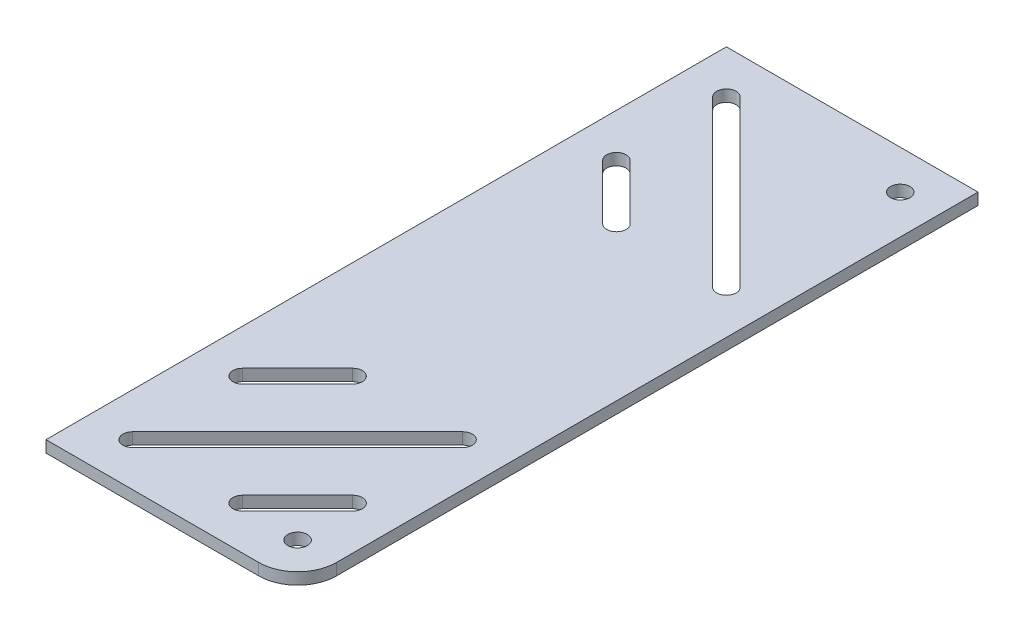
ISO-10303-21;
HEADER;
FILE_DESCRIPTION(('STEP AP214'),'2;1');
FILE_NAME('part.step','',(''),(''),'','','');
FILE_SCHEMA(('AUTOMOTIVE_DESIGN { 1 0 10303 214 1 1 1 1 }'));
ENDSEC;
DATA;
#1=APPLICATION_CONTEXT('core data for automotive mechanical design processes');
#2=APPLICATION_PROTOCOL_DEFINITION('international standard','automotive_design',2000,#1);
#3=PRODUCT_CONTEXT('',#1,'mechanical');
#4=PRODUCT('Part','Part','',(#3));
#5=PRODUCT_RELATED_PRODUCT_CATEGORY('part','',(#4));
#6=PRODUCT_DEFINITION_FORMATION('','',#4);
#7=PRODUCT_DEFINITION_CONTEXT('part definition',#1,'design');
#8=PRODUCT_DEFINITION('design','',#6,#7);
#9=PRODUCT_DEFINITION_SHAPE('','',#8);
#10=(LENGTH_UNIT() NAMED_UNIT(*) SI_UNIT(.MILLI.,.METRE.));
#11=(NAMED_UNIT(*) PLANE_ANGLE_UNIT() SI_UNIT($,.RADIAN.));
#12=(NAMED_UNIT(*) SI_UNIT($,.STERADIAN.) SOLID_ANGLE_UNIT());
#13=UNCERTAINTY_MEASURE_WITH_UNIT(LENGTH_MEASURE(1.E-05),#10,'distance_accuracy_value','');
#14=(GEOMETRIC_REPRESENTATION_CONTEXT(3) GLOBAL_UNCERTAINTY_ASSIGNED_CONTEXT((#13)) GLOBAL_UNIT_ASSIGNED_CONTEXT((#10,
#11,#12)) REPRESENTATION_CONTEXT('',''));
#15=CARTESIAN_POINT('',(0.,0.,0.));
#16=DIRECTION('',(0.,0.,1.));
#17=DIRECTION('',(1.,0.,0.));
#18=AXIS2_PLACEMENT_3D('',#15,#16,#17);
#19=CARTESIAN_POINT('',(180.422470009555,3.,77.4999999999999));
#20=DIRECTION('',(0.,-1.,0.));
#21=DIRECTION('',(0.,0.,-1.));
#22=AXIS2_PLACEMENT_3D('',#19,#20,#21);
#23=PLANE('',#22);
#24=DIRECTION('',(-0.707106781186543,0.,-0.707106781186551));
#25=VECTOR('',#24,1.);
#26=CARTESIAN_POINT('',(138.620155232095,3.,-78.1240920937323));
#27=LINE('',#26,#25);
#28=CARTESIAN_POINT('',(181.046562103288,3.,-35.6976852225392));
#29=VERTEX_POINT('',#28);
#30=CARTESIAN_POINT('',(138.620155232095,3.,-78.1240920937322));
#31=VERTEX_POINT('',#30);
#32=EDGE_CURVE('E418',#29,#31,#27,.T.);
#33=ORIENTED_EDGE('',*,*,#32,.F.);
#34=CARTESIAN_POINT('',(179.278795150321,3.,-33.9299182695728));
#35=DIRECTION('',(0.,1.,0.));
#36=DIRECTION('',(0.,0.,1.));
#37=AXIS2_PLACEMENT_3D('',#34,#35,#36);
#38=CIRCLE('',#37,2.5);
#39=CARTESIAN_POINT('',(177.511028197355,3.,-32.1621513166065));
#40=VERTEX_POINT('',#39);
#41=EDGE_CURVE('E57',#40,#29,#38,.T.);
#42=ORIENTED_EDGE('',*,*,#41,.F.);
#43=DIRECTION('',(0.707106781186543,0.,0.707106781186551));
#44=VECTOR('',#43,1.);
#45=CARTESIAN_POINT('',(135.084621326163,3.,-74.5885581877996));
#46=LINE('',#45,#44);
#47=CARTESIAN_POINT('',(135.084621326163,3.,-74.5885581877996));
#48=VERTEX_POINT('',#47);
#49=EDGE_CURVE('E403',#48,#40,#46,.T.);
#50=ORIENTED_EDGE('',*,*,#49,.F.);
#51=CARTESIAN_POINT('',(136.852388279129,3.,-76.3563251407659));
#52=DIRECTION('',(0.,1.,0.));
#53=DIRECTION('',(0.,0.,-1.));
#54=AXIS2_PLACEMENT_3D('',#51,#52,#53);
#55=CIRCLE('',#54,2.5);
#56=EDGE_CURVE('E422',#31,#48,#55,.T.);
#57=ORIENTED_EDGE('',*,*,#56,.F.);
#58=EDGE_LOOP('',(#33,#42,#50,#57));
#59=FACE_BOUND('',#58,.T.);
#60=DIRECTION('',(-0.707106781186543,0.,-0.707106781186552));
#61=VECTOR('',#60,1.);
#62=CARTESIAN_POINT('',(138.620155232096,3.,-49.8398208462707));
#63=LINE('',#62,#61);
#64=CARTESIAN_POINT('',(152.762290855826,3.,-35.6976852225397));
#65=VERTEX_POINT('',#64);
#66=CARTESIAN_POINT('',(138.620155232095,3.,-49.8398208462703));
#67=VERTEX_POINT('',#66);
#68=EDGE_CURVE('E376',#65,#67,#63,.T.);
#69=ORIENTED_EDGE('',*,*,#68,.F.);
#70=CARTESIAN_POINT('',(150.99452390286,3.,-33.9299182695734));
#71=DIRECTION('',(0.,1.,0.));
#72=DIRECTION('',(0.,0.,1.));
#73=AXIS2_PLACEMENT_3D('',#70,#71,#72);
#74=CIRCLE('',#73,2.5);
#75=CARTESIAN_POINT('',(149.226756949894,3.,-32.162151316607));
#76=VERTEX_POINT('',#75);
#77=EDGE_CURVE('E66',#76,#65,#74,.T.);
#78=ORIENTED_EDGE('',*,*,#77,.F.);
#79=DIRECTION('',(0.707106781186544,0.,0.707106781186552));
#80=VECTOR('',#79,1.);
#81=CARTESIAN_POINT('',(135.084621326163,3.,-46.304286940338));
#82=LINE('',#81,#80);
#83=CARTESIAN_POINT('',(135.084621326163,3.,-46.304286940338));
#84=VERTEX_POINT('',#83);
#85=EDGE_CURVE('E361',#84,#76,#82,.T.);
#86=ORIENTED_EDGE('',*,*,#85,.F.);
#87=CARTESIAN_POINT('',(136.852388279129,3.,-48.0720538933039));
#88=DIRECTION('',(0.,1.,0.));
#89=DIRECTION('',(0.,0.,-1.));
#90=AXIS2_PLACEMENT_3D('',#87,#88,#89);
#91=CIRCLE('',#90,2.50000000000001);
#92=EDGE_CURVE('E380',#67,#84,#91,.T.);
#93=ORIENTED_EDGE('',*,*,#92,.F.);
#94=EDGE_LOOP('',(#69,#78,#86,#93));
#95=FACE_BOUND('',#94,.T.);
#96=DIRECTION('',(0.707106781186547,0.,-0.707106781186548));
#97=VECTOR('',#96,1.);
#98=CARTESIAN_POINT('',(138.620155232095,3.,49.8398208462707));
#99=LINE('',#98,#97);
#100=CARTESIAN_POINT('',(138.620155232095,3.,49.8398208462707));
#101=VERTEX_POINT('',#100);
#102=CARTESIAN_POINT('',(152.762290855826,3.,35.6976852225398));
#103=VERTEX_POINT('',#102);
#104=EDGE_CURVE('E333',#101,#103,#99,.T.);
#105=ORIENTED_EDGE('',*,*,#104,.F.);
#106=CARTESIAN_POINT('',(136.852388279129,3.,48.0720538933043));
#107=DIRECTION('',(0.,1.,0.));
#108=DIRECTION('',(0.,0.,1.));
#109=AXIS2_PLACEMENT_3D('',#106,#107,#108);
#110=CIRCLE('',#109,2.50000000000005);
#111=CARTESIAN_POINT('',(135.084621326162,3.,46.3042869403379));
#112=VERTEX_POINT('',#111);
#113=EDGE_CURVE('E330',#112,#101,#110,.T.);
#114=ORIENTED_EDGE('',*,*,#113,.F.);
#115=DIRECTION('',(-0.707106781186549,0.,0.707106781186546));
#116=VECTOR('',#115,1.);
#117=CARTESIAN_POINT('',(135.084621326162,3.,46.3042869403379));
#118=LINE('',#117,#116);
#119=CARTESIAN_POINT('',(149.226756949893,3.,32.162151316607));
#120=VERTEX_POINT('',#119);
#121=EDGE_CURVE('E317',#120,#112,#118,.T.);
#122=ORIENTED_EDGE('',*,*,#121,.F.);
#123=CARTESIAN_POINT('',(150.99452390286,3.,33.9299182695734));
#124=DIRECTION('',(0.,1.,0.));
#125=DIRECTION('',(0.,0.,-1.));
#126=AXIS2_PLACEMENT_3D('',#123,#124,#125);
#127=CIRCLE('',#126,2.50000000000003);
#128=EDGE_CURVE('E338',#103,#120,#127,.T.);
#129=ORIENTED_EDGE('',*,*,#128,.F.);
#130=EDGE_LOOP('',(#105,#114,#122,#129));
#131=FACE_BOUND('',#130,.T.);
#132=DIRECTION('',(0.707106781186546,0.,-0.707106781186549));
#133=VECTOR('',#132,1.);
#134=CARTESIAN_POINT('',(166.904426479557,3.,78.1240920937325));
#135=LINE('',#134,#133);
#136=CARTESIAN_POINT('',(166.904426479557,3.,78.1240920937325));
#137=VERTEX_POINT('',#136);
#138=CARTESIAN_POINT('',(181.046562103288,3.,63.9819564700018));
#139=VERTEX_POINT('',#138);
#140=EDGE_CURVE('E297',#137,#139,#135,.T.);
#141=ORIENTED_EDGE('',*,*,#140,.F.);
#142=CARTESIAN_POINT('',(165.136659526591,3.,76.3563251407661));
#143=DIRECTION('',(0.,1.,0.));
#144=DIRECTION('',(0.,0.,1.));
#145=AXIS2_PLACEMENT_3D('',#142,#143,#144);
#146=CIRCLE('',#145,2.50000000000005);
#147=CARTESIAN_POINT('',(163.368892573624,3.,74.5885581877997));
#148=VERTEX_POINT('',#147);
#149=EDGE_CURVE('E262',#148,#137,#146,.T.);
#150=ORIENTED_EDGE('',*,*,#149,.F.);
#151=DIRECTION('',(-0.707106781186549,0.,0.707106781186546));
#152=VECTOR('',#151,1.);
#153=CARTESIAN_POINT('',(163.368892573624,3.,74.5885581877997));
#154=LINE('',#153,#152);
#155=CARTESIAN_POINT('',(177.511028197355,3.,60.4464225640688));
#156=VERTEX_POINT('',#155);
#157=EDGE_CURVE('E283',#156,#148,#154,.T.);
#158=ORIENTED_EDGE('',*,*,#157,.F.);
#159=CARTESIAN_POINT('',(179.278795150322,3.,62.2141895170354));
#160=DIRECTION('',(0.,1.,0.));
#161=DIRECTION('',(0.,0.,-1.));
#162=AXIS2_PLACEMENT_3D('',#159,#160,#161);
#163=CIRCLE('',#162,2.50000000000002);
#164=EDGE_CURVE('E288',#139,#156,#163,.T.);
#165=ORIENTED_EDGE('',*,*,#164,.F.);
#166=EDGE_LOOP('',(#141,#150,#158,#165));
#167=FACE_BOUND('',#166,.T.);
#168=DIRECTION('',(0.707106781186548,0.,-0.707106781186547));
#169=VECTOR('',#168,1.);
#170=CARTESIAN_POINT('',(138.620155232095,3.,78.1240920937325));
#171=LINE('',#170,#169);
#172=CARTESIAN_POINT('',(138.620155232095,3.,78.1240920937325));
#173=VERTEX_POINT('',#172);
#174=CARTESIAN_POINT('',(181.046562103288,3.,35.6976852225397));
#175=VERTEX_POINT('',#174);
#176=EDGE_CURVE('E459',#173,#175,#171,.T.);
#177=ORIENTED_EDGE('',*,*,#176,.F.);
#178=CARTESIAN_POINT('',(136.852388279129,3.,76.3563251407661));
#179=DIRECTION('',(0.,1.,0.));
#180=DIRECTION('',(0.,0.,1.));
#181=AXIS2_PLACEMENT_3D('',#178,#179,#180);
#182=CIRCLE('',#181,2.50000000000005);
#183=CARTESIAN_POINT('',(135.084621326162,3.,74.5885581877997));
#184=VERTEX_POINT('',#183);
#185=EDGE_CURVE('E306',#184,#173,#182,.T.);
#186=ORIENTED_EDGE('',*,*,#185,.F.);
#187=DIRECTION('',(-0.707106781186549,0.,0.707106781186546));
#188=VECTOR('',#187,1.);
#189=CARTESIAN_POINT('',(135.084621326162,3.,74.5885581877997));
#190=LINE('',#189,#188);
#191=CARTESIAN_POINT('',(177.511028197355,3.,32.1621513166069));
#192=VERTEX_POINT('',#191);
#193=EDGE_CURVE('E444',#192,#184,#190,.T.);
#194=ORIENTED_EDGE('',*,*,#193,.F.);
#195=CARTESIAN_POINT('',(179.278795150322,3.,33.9299182695733));
#196=DIRECTION('',(0.,1.,0.));
#197=DIRECTION('',(0.,0.,-1.));
#198=AXIS2_PLACEMENT_3D('',#195,#196,#197);
#199=CIRCLE('',#198,2.50000000000002);
#200=EDGE_CURVE('E463',#175,#192,#199,.T.);
#201=ORIENTED_EDGE('',*,*,#200,.F.);
#202=EDGE_LOOP('',(#177,#186,#194,#201));
#203=FACE_BOUND('',#202,.T.);
#204=DIRECTION('',(0.,0.,-1.));
#205=VECTOR('',#204,1.);
#206=CARTESIAN_POINT('',(190.422470009556,3.,-87.5000000000001));
#207=LINE('',#206,#205);
#208=CARTESIAN_POINT('',(190.422470009556,3.,77.4999999999999));
#209=VERTEX_POINT('',#208);
#210=CARTESIAN_POINT('',(190.422470009556,3.,-87.5000000000001));
#211=VERTEX_POINT('',#210);
#212=EDGE_CURVE('E499',#209,#211,#207,.T.);
#213=ORIENTED_EDGE('',*,*,#212,.T.);
#214=DIRECTION('',(-1.,0.,0.));
#215=VECTOR('',#214,1.);
#216=CARTESIAN_POINT('',(180.422470009555,3.,-87.5000000000001));
#217=LINE('',#216,#215);
#218=CARTESIAN_POINT('',(125.708713419895,3.,-87.5000000000001));
#219=VERTEX_POINT('',#218);
#220=EDGE_CURVE('E503',#211,#219,#217,.T.);
#221=ORIENTED_EDGE('',*,*,#220,.T.);
#222=DIRECTION('',(0.,0.,1.));
#223=VECTOR('',#222,1.);
#224=CARTESIAN_POINT('',(125.708713419895,3.,-87.5000000000001));
#225=LINE('',#224,#223);
#226=CARTESIAN_POINT('',(125.708713419895,3.,87.5));
#227=VERTEX_POINT('',#226);
#228=EDGE_CURVE('E507',#219,#227,#225,.T.);
#229=ORIENTED_EDGE('',*,*,#228,.T.);
#230=DIRECTION('',(1.,0.,0.));
#231=VECTOR('',#230,1.);
#232=CARTESIAN_POINT('',(180.422470009556,3.,87.4999999999999));
#233=LINE('',#232,#231);
#234=CARTESIAN_POINT('',(180.422470009556,3.,87.4999999999999));
#235=VERTEX_POINT('',#234);
#236=EDGE_CURVE('E510',#227,#235,#233,.T.);
#237=ORIENTED_EDGE('',*,*,#236,.T.);
#238=CARTESIAN_POINT('',(180.422470009555,3.,77.4999999999999));
#239=DIRECTION('',(0.,1.,0.));
#240=DIRECTION('',(0.,0.,-1.));
#241=AXIS2_PLACEMENT_3D('',#238,#239,#240);
#242=CIRCLE('',#241,10.);
#243=EDGE_CURVE('E513',#235,#209,#242,.T.);
#244=ORIENTED_EDGE('',*,*,#243,.T.);
#245=EDGE_LOOP('',(#213,#221,#229,#237,#244));
#246=FACE_BOUND('',#245,.T.);
#247=CARTESIAN_POINT('',(180.422470009556,3.,-77.5000000000001));
#248=DIRECTION('',(0.,1.,0.));
#249=DIRECTION('',(0.,0.,1.));
#250=AXIS2_PLACEMENT_3D('',#247,#248,#249);
#251=CIRCLE('',#250,2.5);
#252=CARTESIAN_POINT('',(180.422470009556,3.,-75.0000000000001));
#253=VERTEX_POINT('',#252);
#254=EDGE_CURVE('E491',#253,#253,#251,.T.);
#255=ORIENTED_EDGE('',*,*,#254,.F.);
#256=EDGE_LOOP('',(#255));
#257=FACE_BOUND('',#256,.T.);
#258=CARTESIAN_POINT('',(180.422470009555,3.,77.4999999999999));
#259=DIRECTION('',(0.,1.,0.));
#260=DIRECTION('',(0.,0.,1.));
#261=AXIS2_PLACEMENT_3D('',#258,#259,#260);
#262=CIRCLE('',#261,2.49999999999999);
#263=CARTESIAN_POINT('',(180.422470009555,3.,79.9999999999999));
#264=VERTEX_POINT('',#263);
#265=EDGE_CURVE('E483',#264,#264,#262,.T.);
#266=ORIENTED_EDGE('',*,*,#265,.F.);
#267=EDGE_LOOP('',(#266));
#268=FACE_BOUND('',#267,.T.);
#269=ADVANCED_FACE('F38',(#59,#95,#131,#167,#203,#246,#257,#268),#23,.F.);
#270=CARTESIAN_POINT('',(180.422470009555,0.,77.4999999999999));
#271=DIRECTION('',(0.,-1.,0.));
#272=DIRECTION('',(0.,0.,-1.));
#273=AXIS2_PLACEMENT_3D('',#270,#271,#272);
#274=PLANE('',#273);
#275=CARTESIAN_POINT('',(179.278795150321,0.,-33.9299182695728));
#276=DIRECTION('',(0.,1.,0.));
#277=DIRECTION('',(0.,0.,1.));
#278=AXIS2_PLACEMENT_3D('',#275,#276,#277);
#279=CIRCLE('',#278,2.5);
#280=CARTESIAN_POINT('',(177.511028197355,0.,-32.1621513166065));
#281=VERTEX_POINT('',#280);
#282=CARTESIAN_POINT('',(181.046562103288,0.,-35.6976852225392));
#283=VERTEX_POINT('',#282);
#284=EDGE_CURVE('E398',#281,#283,#279,.T.);
#285=ORIENTED_EDGE('',*,*,#284,.T.);
#286=DIRECTION('',(-0.707106781186543,0.,-0.707106781186551));
#287=VECTOR('',#286,1.);
#288=CARTESIAN_POINT('',(138.620155232095,0.,-78.1240920937323));
#289=LINE('',#288,#287);
#290=CARTESIAN_POINT('',(138.620155232095,0.,-78.1240920937322));
#291=VERTEX_POINT('',#290);
#292=EDGE_CURVE('E402',#283,#291,#289,.T.);
#293=ORIENTED_EDGE('',*,*,#292,.T.);
#294=CARTESIAN_POINT('',(136.852388279129,0.,-76.3563251407659));
#295=DIRECTION('',(0.,1.,0.));
#296=DIRECTION('',(0.,0.,-1.));
#297=AXIS2_PLACEMENT_3D('',#294,#295,#296);
#298=CIRCLE('',#297,2.5);
#299=CARTESIAN_POINT('',(135.084621326163,0.,-74.5885581877996));
#300=VERTEX_POINT('',#299);
#301=EDGE_CURVE('E407',#291,#300,#298,.T.);
#302=ORIENTED_EDGE('',*,*,#301,.T.);
#303=DIRECTION('',(0.707106781186543,0.,0.707106781186551));
#304=VECTOR('',#303,1.);
#305=CARTESIAN_POINT('',(135.084621326163,0.,-74.5885581877996));
#306=LINE('',#305,#304);
#307=EDGE_CURVE('E411',#300,#281,#306,.T.);
#308=ORIENTED_EDGE('',*,*,#307,.T.);
#309=EDGE_LOOP('',(#285,#293,#302,#308));
#310=FACE_BOUND('',#309,.T.);
#311=CARTESIAN_POINT('',(150.99452390286,0.,-33.9299182695734));
#312=DIRECTION('',(0.,1.,0.));
#313=DIRECTION('',(0.,0.,1.));
#314=AXIS2_PLACEMENT_3D('',#311,#312,#313);
#315=CIRCLE('',#314,2.5);
#316=CARTESIAN_POINT('',(149.226756949894,0.,-32.162151316607));
#317=VERTEX_POINT('',#316);
#318=CARTESIAN_POINT('',(152.762290855826,0.,-35.6976852225397));
#319=VERTEX_POINT('',#318);
#320=EDGE_CURVE('E356',#317,#319,#315,.T.);
#321=ORIENTED_EDGE('',*,*,#320,.T.);
#322=DIRECTION('',(-0.707106781186543,0.,-0.707106781186552));
#323=VECTOR('',#322,1.);
#324=CARTESIAN_POINT('',(138.620155232096,0.,-49.8398208462707));
#325=LINE('',#324,#323);
#326=CARTESIAN_POINT('',(138.620155232096,0.,-49.8398208462703));
#327=VERTEX_POINT('',#326);
#328=EDGE_CURVE('E360',#319,#327,#325,.T.);
#329=ORIENTED_EDGE('',*,*,#328,.T.);
#330=CARTESIAN_POINT('',(136.852388279129,0.,-48.0720538933039));
#331=DIRECTION('',(0.,1.,0.));
#332=DIRECTION('',(0.,0.,-1.));
#333=AXIS2_PLACEMENT_3D('',#330,#331,#332);
#334=CIRCLE('',#333,2.50000000000001);
#335=CARTESIAN_POINT('',(135.084621326163,0.,-46.304286940338));
#336=VERTEX_POINT('',#335);
#337=EDGE_CURVE('E365',#327,#336,#334,.T.);
#338=ORIENTED_EDGE('',*,*,#337,.T.);
#339=DIRECTION('',(0.707106781186544,0.,0.707106781186552));
#340=VECTOR('',#339,1.);
#341=CARTESIAN_POINT('',(135.084621326163,0.,-46.304286940338));
#342=LINE('',#341,#340);
#343=EDGE_CURVE('E369',#336,#317,#342,.T.);
#344=ORIENTED_EDGE('',*,*,#343,.T.);
#345=EDGE_LOOP('',(#321,#329,#338,#344));
#346=FACE_BOUND('',#345,.T.);
#347=CARTESIAN_POINT('',(136.852388279129,0.,48.0720538933043));
#348=DIRECTION('',(0.,1.,0.));
#349=DIRECTION('',(0.,0.,1.));
#350=AXIS2_PLACEMENT_3D('',#347,#348,#349);
#351=CIRCLE('',#350,2.50000000000005);
#352=CARTESIAN_POINT('',(135.084621326162,0.,46.3042869403379));
#353=VERTEX_POINT('',#352);
#354=CARTESIAN_POINT('',(138.620155232095,0.,49.8398208462707));
#355=VERTEX_POINT('',#354);
#356=EDGE_CURVE('E312',#353,#355,#351,.T.);
#357=ORIENTED_EDGE('',*,*,#356,.T.);
#358=DIRECTION('',(0.707106781186547,0.,-0.707106781186548));
#359=VECTOR('',#358,1.);
#360=CARTESIAN_POINT('',(138.620155232095,0.,49.8398208462707));
#361=LINE('',#360,#359);
#362=CARTESIAN_POINT('',(152.762290855826,0.,35.6976852225398));
#363=VERTEX_POINT('',#362);
#364=EDGE_CURVE('E316',#355,#363,#361,.T.);
#365=ORIENTED_EDGE('',*,*,#364,.T.);
#366=CARTESIAN_POINT('',(150.99452390286,0.,33.9299182695734));
#367=DIRECTION('',(0.,1.,0.));
#368=DIRECTION('',(0.,0.,-1.));
#369=AXIS2_PLACEMENT_3D('',#366,#367,#368);
#370=CIRCLE('',#369,2.50000000000003);
#371=CARTESIAN_POINT('',(149.226756949893,0.,32.162151316607));
#372=VERTEX_POINT('',#371);
#373=EDGE_CURVE('E321',#363,#372,#370,.T.);
#374=ORIENTED_EDGE('',*,*,#373,.T.);
#375=DIRECTION('',(-0.707106781186549,0.,0.707106781186546));
#376=VECTOR('',#375,1.);
#377=CARTESIAN_POINT('',(135.084621326162,0.,46.3042869403379));
#378=LINE('',#377,#376);
#379=EDGE_CURVE('E325',#372,#353,#378,.T.);
#380=ORIENTED_EDGE('',*,*,#379,.T.);
#381=EDGE_LOOP('',(#357,#365,#374,#380));
#382=FACE_BOUND('',#381,.T.);
#383=CARTESIAN_POINT('',(165.136659526591,0.,76.3563251407661));
#384=DIRECTION('',(0.,1.,0.));
#385=DIRECTION('',(0.,0.,1.));
#386=AXIS2_PLACEMENT_3D('',#383,#384,#385);
#387=CIRCLE('',#386,2.50000000000005);
#388=CARTESIAN_POINT('',(163.368892573624,0.,74.5885581877997));
#389=VERTEX_POINT('',#388);
#390=CARTESIAN_POINT('',(166.904426479557,0.,78.1240920937325));
#391=VERTEX_POINT('',#390);
#392=EDGE_CURVE('E259',#389,#391,#387,.T.);
#393=ORIENTED_EDGE('',*,*,#392,.T.);
#394=DIRECTION('',(0.707106781186546,0.,-0.707106781186549));
#395=VECTOR('',#394,1.);
#396=CARTESIAN_POINT('',(166.904426479557,0.,78.1240920937325));
#397=LINE('',#396,#395);
#398=CARTESIAN_POINT('',(181.046562103288,0.,63.9819564700018));
#399=VERTEX_POINT('',#398);
#400=EDGE_CURVE('E272',#391,#399,#397,.T.);
#401=ORIENTED_EDGE('',*,*,#400,.T.);
#402=CARTESIAN_POINT('',(179.278795150322,0.,62.2141895170354));
#403=DIRECTION('',(0.,1.,0.));
#404=DIRECTION('',(0.,0.,-1.));
#405=AXIS2_PLACEMENT_3D('',#402,#403,#404);
#406=CIRCLE('',#405,2.50000000000002);
#407=CARTESIAN_POINT('',(177.511028197355,0.,60.4464225640688));
#408=VERTEX_POINT('',#407);
#409=EDGE_CURVE('E277',#399,#408,#406,.T.);
#410=ORIENTED_EDGE('',*,*,#409,.T.);
#411=DIRECTION('',(-0.707106781186549,0.,0.707106781186546));
#412=VECTOR('',#411,1.);
#413=CARTESIAN_POINT('',(163.368892573624,0.,74.5885581877997));
#414=LINE('',#413,#412);
#415=EDGE_CURVE('E268',#408,#389,#414,.T.);
#416=ORIENTED_EDGE('',*,*,#415,.T.);
#417=EDGE_LOOP('',(#393,#401,#410,#416));
#418=FACE_BOUND('',#417,.T.);
#419=CARTESIAN_POINT('',(136.852388279129,0.,76.3563251407661));
#420=DIRECTION('',(0.,1.,0.));
#421=DIRECTION('',(0.,0.,1.));
#422=AXIS2_PLACEMENT_3D('',#419,#420,#421);
#423=CIRCLE('',#422,2.50000000000005);
#424=CARTESIAN_POINT('',(135.084621326162,0.,74.5885581877997));
#425=VERTEX_POINT('',#424);
#426=CARTESIAN_POINT('',(138.620155232095,0.,78.1240920937325));
#427=VERTEX_POINT('',#426);
#428=EDGE_CURVE('E439',#425,#427,#423,.T.);
#429=ORIENTED_EDGE('',*,*,#428,.T.);
#430=DIRECTION('',(0.707106781186548,0.,-0.707106781186547));
#431=VECTOR('',#430,1.);
#432=CARTESIAN_POINT('',(138.620155232095,0.,78.1240920937325));
#433=LINE('',#432,#431);
#434=CARTESIAN_POINT('',(181.046562103288,0.,35.6976852225397));
#435=VERTEX_POINT('',#434);
#436=EDGE_CURVE('E443',#427,#435,#433,.T.);
#437=ORIENTED_EDGE('',*,*,#436,.T.);
#438=CARTESIAN_POINT('',(179.278795150322,0.,33.9299182695733));
#439=DIRECTION('',(0.,1.,0.));
#440=DIRECTION('',(0.,0.,-1.));
#441=AXIS2_PLACEMENT_3D('',#438,#439,#440);
#442=CIRCLE('',#441,2.50000000000002);
#443=CARTESIAN_POINT('',(177.511028197355,0.,32.1621513166069));
#444=VERTEX_POINT('',#443);
#445=EDGE_CURVE('E448',#435,#444,#442,.T.);
#446=ORIENTED_EDGE('',*,*,#445,.T.);
#447=DIRECTION('',(-0.707106781186549,0.,0.707106781186546));
#448=VECTOR('',#447,1.);
#449=CARTESIAN_POINT('',(135.084621326162,0.,74.5885581877997));
#450=LINE('',#449,#448);
#451=EDGE_CURVE('E452',#444,#425,#450,.T.);
#452=ORIENTED_EDGE('',*,*,#451,.T.);
#453=EDGE_LOOP('',(#429,#437,#446,#452));
#454=FACE_BOUND('',#453,.T.);
#455=CARTESIAN_POINT('',(180.422470009556,0.,-77.5000000000001));
#456=DIRECTION('',(0.,1.,0.));
#457=DIRECTION('',(0.,0.,1.));
#458=AXIS2_PLACEMENT_3D('',#455,#456,#457);
#459=CIRCLE('',#458,2.5);
#460=CARTESIAN_POINT('',(180.422470009556,0.,-75.0000000000001));
#461=VERTEX_POINT('',#460);
#462=EDGE_CURVE('E487',#461,#461,#459,.T.);
#463=ORIENTED_EDGE('',*,*,#462,.T.);
#464=EDGE_LOOP('',(#463));
#465=FACE_BOUND('',#464,.T.);
#466=DIRECTION('',(-1.,0.,0.));
#467=VECTOR('',#466,1.);
#468=CARTESIAN_POINT('',(125.708713419895,0.,-87.5000000000001));
#469=LINE('',#468,#467);
#470=CARTESIAN_POINT('',(190.422470009556,0.,-87.5000000000001));
#471=VERTEX_POINT('',#470);
#472=CARTESIAN_POINT('',(125.708713419895,0.,-87.5000000000001));
#473=VERTEX_POINT('',#472);
#474=EDGE_CURVE('E495',#471,#473,#469,.T.);
#475=ORIENTED_EDGE('',*,*,#474,.F.);
#476=DIRECTION('',(0.,0.,-1.));
#477=VECTOR('',#476,1.);
#478=CARTESIAN_POINT('',(190.422470009556,0.,-77.5000000000001));
#479=LINE('',#478,#477);
#480=CARTESIAN_POINT('',(190.422470009556,0.,77.4999999999999));
#481=VERTEX_POINT('',#480);
#482=EDGE_CURVE('E504',#481,#471,#479,.T.);
#483=ORIENTED_EDGE('',*,*,#482,.F.);
#484=CARTESIAN_POINT('',(180.422470009555,0.,77.4999999999999));
#485=DIRECTION('',(0.,1.,0.));
#486=DIRECTION('',(0.,0.,-1.));
#487=AXIS2_PLACEMENT_3D('',#484,#485,#486);
#488=CIRCLE('',#487,10.);
#489=CARTESIAN_POINT('',(180.422470009556,0.,87.4999999999999));
#490=VERTEX_POINT('',#489);
#491=EDGE_CURVE('E526',#490,#481,#488,.T.);
#492=ORIENTED_EDGE('',*,*,#491,.F.);
#493=DIRECTION('',(1.,0.,0.));
#494=VECTOR('',#493,1.);
#495=CARTESIAN_POINT('',(180.422470009556,0.,87.4999999999999));
#496=LINE('',#495,#494);
#497=CARTESIAN_POINT('',(125.708713419895,0.,87.5));
#498=VERTEX_POINT('',#497);
#499=EDGE_CURVE('E523',#498,#490,#496,.T.);
#500=ORIENTED_EDGE('',*,*,#499,.F.);
#501=DIRECTION('',(0.,0.,1.));
#502=VECTOR('',#501,1.);
#503=CARTESIAN_POINT('',(125.708713419895,0.,-87.5000000000001));
#504=LINE('',#503,#502);
#505=EDGE_CURVE('E520',#473,#498,#504,.T.);
#506=ORIENTED_EDGE('',*,*,#505,.F.);
#507=EDGE_LOOP('',(#475,#483,#492,#500,#506));
#508=FACE_BOUND('',#507,.T.);
#509=CARTESIAN_POINT('',(180.422470009555,0.,77.4999999999999));
#510=DIRECTION('',(0.,1.,0.));
#511=DIRECTION('',(0.,0.,1.));
#512=AXIS2_PLACEMENT_3D('',#509,#510,#511);
#513=CIRCLE('',#512,2.49999999999999);
#514=CARTESIAN_POINT('',(180.422470009555,0.,79.9999999999999));
#515=VERTEX_POINT('',#514);
#516=EDGE_CURVE('E473',#515,#515,#513,.T.);
#517=ORIENTED_EDGE('',*,*,#516,.T.);
#518=EDGE_LOOP('',(#517));
#519=FACE_BOUND('',#518,.T.);
#520=ADVANCED_FACE('F279',(#310,#346,#382,#418,#454,#465,#508,#519),#274,.T.);
#521=CARTESIAN_POINT('',(125.708713419895,3.,-87.5000000000001));
#522=DIRECTION('',(0.,0.,1.));
#523=DIRECTION('',(1.,0.,0.));
#524=AXIS2_PLACEMENT_3D('',#521,#522,#523);
#525=PLANE('',#524);
#526=ORIENTED_EDGE('',*,*,#474,.T.);
#527=DIRECTION('',(0.,-1.,0.));
#528=VECTOR('',#527,1.);
#529=CARTESIAN_POINT('',(125.708713419895,3.,-87.5000000000001));
#530=LINE('',#529,#528);
#531=EDGE_CURVE('E47',#219,#473,#530,.T.);
#532=ORIENTED_EDGE('',*,*,#531,.F.);
#533=ORIENTED_EDGE('',*,*,#220,.F.);
#534=DIRECTION('',(0.,-1.,0.));
#535=VECTOR('',#534,1.);
#536=CARTESIAN_POINT('',(190.422470009556,3.,-87.5000000000001));
#537=LINE('',#536,#535);
#538=EDGE_CURVE('E11',#211,#471,#537,.T.);
#539=ORIENTED_EDGE('',*,*,#538,.T.);
#540=EDGE_LOOP('',(#526,#532,#533,#539));
#541=FACE_BOUND('',#540,.T.);
#542=ADVANCED_FACE('F40',(#541),#525,.F.);
#543=CARTESIAN_POINT('',(125.708713419895,3.,-87.5000000000001));
#544=DIRECTION('',(1.,0.,0.));
#545=DIRECTION('',(0.,0.,-1.));
#546=AXIS2_PLACEMENT_3D('',#543,#544,#545);
#547=PLANE('',#546);
#548=ORIENTED_EDGE('',*,*,#505,.T.);
#549=DIRECTION('',(0.,-1.,0.));
#550=VECTOR('',#549,1.);
#551=CARTESIAN_POINT('',(125.708713419895,3.,87.5));
#552=LINE('',#551,#550);
#553=EDGE_CURVE('E539',#227,#498,#552,.T.);
#554=ORIENTED_EDGE('',*,*,#553,.F.);
#555=ORIENTED_EDGE('',*,*,#228,.F.);
#556=ORIENTED_EDGE('',*,*,#531,.T.);
#557=EDGE_LOOP('',(#548,#554,#555,#556));
#558=FACE_BOUND('',#557,.T.);
#559=ADVANCED_FACE('F548',(#558),#547,.F.);
#560=CARTESIAN_POINT('',(180.422470009556,3.,87.4999999999999));
#561=DIRECTION('',(0.,0.,-1.));
#562=DIRECTION('',(-1.,0.,0.));
#563=AXIS2_PLACEMENT_3D('',#560,#561,#562);
#564=PLANE('',#563);
#565=ORIENTED_EDGE('',*,*,#499,.T.);
#566=DIRECTION('',(0.,-1.,0.));
#567=VECTOR('',#566,1.);
#568=CARTESIAN_POINT('',(180.422470009556,3.,87.4999999999999));
#569=LINE('',#568,#567);
#570=EDGE_CURVE('E535',#235,#490,#569,.T.);
#571=ORIENTED_EDGE('',*,*,#570,.F.);
#572=ORIENTED_EDGE('',*,*,#236,.F.);
#573=ORIENTED_EDGE('',*,*,#553,.T.);
#574=EDGE_LOOP('',(#565,#571,#572,#573));
#575=FACE_BOUND('',#574,.T.);
#576=ADVANCED_FACE('F558',(#575),#564,.F.);
#577=CARTESIAN_POINT('',(180.422470009555,3.,77.4999999999999));
#578=DIRECTION('',(0.,-1.,0.));
#579=DIRECTION('',(0.,0.,-1.));
#580=AXIS2_PLACEMENT_3D('',#577,#578,#579);
#581=CYLINDRICAL_SURFACE('',#580,10.);
#582=ORIENTED_EDGE('',*,*,#491,.T.);
#583=DIRECTION('',(0.,-1.,0.));
#584=VECTOR('',#583,1.);
#585=CARTESIAN_POINT('',(190.422470009556,3.,77.4999999999999));
#586=LINE('',#585,#584);
#587=EDGE_CURVE('E517',#209,#481,#586,.T.);
#588=ORIENTED_EDGE('',*,*,#587,.F.);
#589=ORIENTED_EDGE('',*,*,#243,.F.);
#590=ORIENTED_EDGE('',*,*,#570,.T.);
#591=EDGE_LOOP('',(#582,#588,#589,#590));
#592=FACE_BOUND('',#591,.T.);
#593=ADVANCED_FACE('F562',(#592),#581,.T.);
#594=CARTESIAN_POINT('',(190.422470009556,3.,-77.5000000000001));
#595=DIRECTION('',(-1.,0.,0.));
#596=DIRECTION('',(0.,0.,1.));
#597=AXIS2_PLACEMENT_3D('',#594,#595,#596);
#598=PLANE('',#597);
#599=ORIENTED_EDGE('',*,*,#482,.T.);
#600=ORIENTED_EDGE('',*,*,#538,.F.);
#601=ORIENTED_EDGE('',*,*,#212,.F.);
#602=ORIENTED_EDGE('',*,*,#587,.T.);
#603=EDGE_LOOP('',(#599,#600,#601,#602));
#604=FACE_BOUND('',#603,.T.);
#605=ADVANCED_FACE('F568',(#604),#598,.F.);
#606=CARTESIAN_POINT('',(180.422470009556,3.,-77.5000000000001));
#607=DIRECTION('',(0.,-1.,0.));
#608=DIRECTION('',(0.,0.,-1.));
#609=AXIS2_PLACEMENT_3D('',#606,#607,#608);
#610=CYLINDRICAL_SURFACE('',#609,2.5);
#611=ORIENTED_EDGE('',*,*,#254,.T.);
#612=EDGE_LOOP('',(#611));
#613=FACE_BOUND('',#612,.T.);
#614=ORIENTED_EDGE('',*,*,#462,.F.);
#615=EDGE_LOOP('',(#614));
#616=FACE_BOUND('',#615,.T.);
#617=ADVANCED_FACE('F570',(#613,#616),#610,.F.);
#618=CARTESIAN_POINT('',(180.422470009555,3.,77.4999999999999));
#619=DIRECTION('',(0.,-1.,0.));
#620=DIRECTION('',(0.,0.,-1.));
#621=AXIS2_PLACEMENT_3D('',#618,#619,#620);
#622=CYLINDRICAL_SURFACE('',#621,2.49999999999999);
#623=ORIENTED_EDGE('',*,*,#265,.T.);
#624=EDGE_LOOP('',(#623));
#625=FACE_BOUND('',#624,.T.);
#626=ORIENTED_EDGE('',*,*,#516,.F.);
#627=EDGE_LOOP('',(#626));
#628=FACE_BOUND('',#627,.T.);
#629=ADVANCED_FACE('F576',(#625,#628),#622,.F.);
#630=CARTESIAN_POINT('',(136.852388279129,0.,76.3563251407661));
#631=DIRECTION('',(0.,1.,0.));
#632=DIRECTION('',(0.,0.,1.));
#633=AXIS2_PLACEMENT_3D('',#630,#631,#632);
#634=CYLINDRICAL_SURFACE('',#633,2.50000000000005);
#635=ORIENTED_EDGE('',*,*,#185,.T.);
#636=DIRECTION('',(0.,1.,0.));
#637=VECTOR('',#636,1.);
#638=CARTESIAN_POINT('',(138.620155232095,0.,78.1240920937325));
#639=LINE('',#638,#637);
#640=EDGE_CURVE('E456',#427,#173,#639,.T.);
#641=ORIENTED_EDGE('',*,*,#640,.F.);
#642=ORIENTED_EDGE('',*,*,#428,.F.);
#643=DIRECTION('',(0.,1.,0.));
#644=VECTOR('',#643,1.);
#645=CARTESIAN_POINT('',(135.084621326162,0.,74.5885581877997));
#646=LINE('',#645,#644);
#647=EDGE_CURVE('E470',#425,#184,#646,.T.);
#648=ORIENTED_EDGE('',*,*,#647,.T.);
#649=EDGE_LOOP('',(#635,#641,#642,#648));
#650=FACE_BOUND('',#649,.T.);
#651=ADVANCED_FACE('F593',(#650),#634,.F.);
#652=CARTESIAN_POINT('',(135.084621326162,0.,74.5885581877997));
#653=DIRECTION('',(-0.707106781186546,0.,-0.707106781186548));
#654=DIRECTION('',(-0.707106781186549,0.,0.707106781186546));
#655=AXIS2_PLACEMENT_3D('',#652,#653,#654);
#656=PLANE('',#655);
#657=ORIENTED_EDGE('',*,*,#193,.T.);
#658=ORIENTED_EDGE('',*,*,#647,.F.);
#659=ORIENTED_EDGE('',*,*,#451,.F.);
#660=DIRECTION('',(0.,1.,0.));
#661=VECTOR('',#660,1.);
#662=CARTESIAN_POINT('',(177.511028197355,0.,32.1621513166069));
#663=LINE('',#662,#661);
#664=EDGE_CURVE('E474',#444,#192,#663,.T.);
#665=ORIENTED_EDGE('',*,*,#664,.T.);
#666=EDGE_LOOP('',(#657,#658,#659,#665));
#667=FACE_BOUND('',#666,.T.);
#668=ADVANCED_FACE('F597',(#667),#656,.F.);
#669=CARTESIAN_POINT('',(179.278795150322,0.,33.9299182695733));
#670=DIRECTION('',(0.,1.,0.));
#671=DIRECTION('',(0.,0.,1.));
#672=AXIS2_PLACEMENT_3D('',#669,#670,#671);
#673=CYLINDRICAL_SURFACE('',#672,2.50000000000002);
#674=ORIENTED_EDGE('',*,*,#200,.T.);
#675=ORIENTED_EDGE('',*,*,#664,.F.);
#676=ORIENTED_EDGE('',*,*,#445,.F.);
#677=DIRECTION('',(0.,1.,0.));
#678=VECTOR('',#677,1.);
#679=CARTESIAN_POINT('',(181.046562103288,0.,35.6976852225397));
#680=LINE('',#679,#678);
#681=EDGE_CURVE('E477',#435,#175,#680,.T.);
#682=ORIENTED_EDGE('',*,*,#681,.T.);
#683=EDGE_LOOP('',(#674,#675,#676,#682));
#684=FACE_BOUND('',#683,.T.);
#685=ADVANCED_FACE('F602',(#684),#673,.F.);
#686=CARTESIAN_POINT('',(138.620155232095,0.,78.1240920937325));
#687=DIRECTION('',(0.707106781186547,0.,0.707106781186548));
#688=DIRECTION('',(0.707106781186548,0.,-0.707106781186547));
#689=AXIS2_PLACEMENT_3D('',#686,#687,#688);
#690=PLANE('',#689);
#691=ORIENTED_EDGE('',*,*,#176,.T.);
#692=ORIENTED_EDGE('',*,*,#681,.F.);
#693=ORIENTED_EDGE('',*,*,#436,.F.);
#694=ORIENTED_EDGE('',*,*,#640,.T.);
#695=EDGE_LOOP('',(#691,#692,#693,#694));
#696=FACE_BOUND('',#695,.T.);
#697=ADVANCED_FACE('F599',(#696),#690,.F.);
#698=CARTESIAN_POINT('',(165.136659526591,0.,76.3563251407661));
#699=DIRECTION('',(0.,1.,0.));
#700=DIRECTION('',(0.,0.,1.));
#701=AXIS2_PLACEMENT_3D('',#698,#699,#700);
#702=CYLINDRICAL_SURFACE('',#701,2.50000000000005);
#703=ORIENTED_EDGE('',*,*,#149,.T.);
#704=DIRECTION('',(0.,1.,0.));
#705=VECTOR('',#704,1.);
#706=CARTESIAN_POINT('',(166.904426479557,0.,78.1240920937325));
#707=LINE('',#706,#705);
#708=EDGE_CURVE('E255',#391,#137,#707,.T.);
#709=ORIENTED_EDGE('',*,*,#708,.F.);
#710=ORIENTED_EDGE('',*,*,#392,.F.);
#711=DIRECTION('',(0.,1.,0.));
#712=VECTOR('',#711,1.);
#713=CARTESIAN_POINT('',(163.368892573624,0.,74.5885581877997));
#714=LINE('',#713,#712);
#715=EDGE_CURVE('E304',#389,#148,#714,.T.);
#716=ORIENTED_EDGE('',*,*,#715,.T.);
#717=EDGE_LOOP('',(#703,#709,#710,#716));
#718=FACE_BOUND('',#717,.T.);
#719=ADVANCED_FACE('F257',(#718),#702,.F.);
#720=CARTESIAN_POINT('',(163.368892573624,0.,74.5885581877997));
#721=DIRECTION('',(-0.707106781186546,0.,-0.707106781186549));
#722=DIRECTION('',(-0.707106781186549,0.,0.707106781186546));
#723=AXIS2_PLACEMENT_3D('',#720,#721,#722);
#724=PLANE('',#723);
#725=ORIENTED_EDGE('',*,*,#157,.T.);
#726=ORIENTED_EDGE('',*,*,#715,.F.);
#727=ORIENTED_EDGE('',*,*,#415,.F.);
#728=DIRECTION('',(0.,1.,0.));
#729=VECTOR('',#728,1.);
#730=CARTESIAN_POINT('',(177.511028197355,0.,60.4464225640688));
#731=LINE('',#730,#729);
#732=EDGE_CURVE('E307',#408,#156,#731,.T.);
#733=ORIENTED_EDGE('',*,*,#732,.T.);
#734=EDGE_LOOP('',(#725,#726,#727,#733));
#735=FACE_BOUND('',#734,.T.);
#736=ADVANCED_FACE('F658',(#735),#724,.F.);
#737=CARTESIAN_POINT('',(179.278795150322,0.,62.2141895170354));
#738=DIRECTION('',(0.,1.,0.));
#739=DIRECTION('',(0.,0.,1.));
#740=AXIS2_PLACEMENT_3D('',#737,#738,#739);
#741=CYLINDRICAL_SURFACE('',#740,2.50000000000002);
#742=ORIENTED_EDGE('',*,*,#164,.T.);
#743=ORIENTED_EDGE('',*,*,#732,.F.);
#744=ORIENTED_EDGE('',*,*,#409,.F.);
#745=DIRECTION('',(0.,1.,0.));
#746=VECTOR('',#745,1.);
#747=CARTESIAN_POINT('',(181.046562103288,0.,63.9819564700018));
#748=LINE('',#747,#746);
#749=EDGE_CURVE('E267',#399,#139,#748,.T.);
#750=ORIENTED_EDGE('',*,*,#749,.T.);
#751=EDGE_LOOP('',(#742,#743,#744,#750));
#752=FACE_BOUND('',#751,.T.);
#753=ADVANCED_FACE('F661',(#752),#741,.F.);
#754=CARTESIAN_POINT('',(166.904426479557,0.,78.1240920937325));
#755=DIRECTION('',(0.707106781186548,0.,0.707106781186546));
#756=DIRECTION('',(0.707106781186546,0.,-0.707106781186549));
#757=AXIS2_PLACEMENT_3D('',#754,#755,#756);
#758=PLANE('',#757);
#759=ORIENTED_EDGE('',*,*,#140,.T.);
#760=ORIENTED_EDGE('',*,*,#749,.F.);
#761=ORIENTED_EDGE('',*,*,#400,.F.);
#762=ORIENTED_EDGE('',*,*,#708,.T.);
#763=EDGE_LOOP('',(#759,#760,#761,#762));
#764=FACE_BOUND('',#763,.T.);
#765=ADVANCED_FACE('F273',(#764),#758,.F.);
#766=CARTESIAN_POINT('',(136.852388279129,0.,48.0720538933043));
#767=DIRECTION('',(0.,1.,0.));
#768=DIRECTION('',(0.,0.,1.));
#769=AXIS2_PLACEMENT_3D('',#766,#767,#768);
#770=CYLINDRICAL_SURFACE('',#769,2.50000000000005);
#771=ORIENTED_EDGE('',*,*,#113,.T.);
#772=DIRECTION('',(0.,1.,0.));
#773=VECTOR('',#772,1.);
#774=CARTESIAN_POINT('',(138.620155232095,0.,49.8398208462707));
#775=LINE('',#774,#773);
#776=EDGE_CURVE('E329',#355,#101,#775,.T.);
#777=ORIENTED_EDGE('',*,*,#776,.F.);
#778=ORIENTED_EDGE('',*,*,#356,.F.);
#779=DIRECTION('',(0.,1.,0.));
#780=VECTOR('',#779,1.);
#781=CARTESIAN_POINT('',(135.084621326162,0.,46.3042869403379));
#782=LINE('',#781,#780);
#783=EDGE_CURVE('E298',#353,#112,#782,.T.);
#784=ORIENTED_EDGE('',*,*,#783,.T.);
#785=EDGE_LOOP('',(#771,#777,#778,#784));
#786=FACE_BOUND('',#785,.T.);
#787=ADVANCED_FACE('F641',(#786),#770,.F.);
#788=CARTESIAN_POINT('',(135.084621326162,0.,46.3042869403379));
#789=DIRECTION('',(-0.707106781186546,0.,-0.707106781186548));
#790=DIRECTION('',(-0.707106781186549,0.,0.707106781186546));
#791=AXIS2_PLACEMENT_3D('',#788,#789,#790);
#792=PLANE('',#791);
#793=ORIENTED_EDGE('',*,*,#121,.T.);
#794=ORIENTED_EDGE('',*,*,#783,.F.);
#795=ORIENTED_EDGE('',*,*,#379,.F.);
#796=DIRECTION('',(0.,1.,0.));
#797=VECTOR('',#796,1.);
#798=CARTESIAN_POINT('',(149.226756949893,0.,32.162151316607));
#799=LINE('',#798,#797);
#800=EDGE_CURVE('E347',#372,#120,#799,.T.);
#801=ORIENTED_EDGE('',*,*,#800,.T.);
#802=EDGE_LOOP('',(#793,#794,#795,#801));
#803=FACE_BOUND('',#802,.T.);
#804=ADVANCED_FACE('F644',(#803),#792,.F.);
#805=CARTESIAN_POINT('',(150.99452390286,0.,33.9299182695734));
#806=DIRECTION('',(0.,1.,0.));
#807=DIRECTION('',(0.,0.,1.));
#808=AXIS2_PLACEMENT_3D('',#805,#806,#807);
#809=CYLINDRICAL_SURFACE('',#808,2.50000000000003);
#810=ORIENTED_EDGE('',*,*,#128,.T.);
#811=ORIENTED_EDGE('',*,*,#800,.F.);
#812=ORIENTED_EDGE('',*,*,#373,.F.);
#813=DIRECTION('',(0.,1.,0.));
#814=VECTOR('',#813,1.);
#815=CARTESIAN_POINT('',(152.762290855826,0.,35.6976852225398));
#816=LINE('',#815,#814);
#817=EDGE_CURVE('E350',#363,#103,#816,.T.);
#818=ORIENTED_EDGE('',*,*,#817,.T.);
#819=EDGE_LOOP('',(#810,#811,#812,#818));
#820=FACE_BOUND('',#819,.T.);
#821=ADVANCED_FACE('F648',(#820),#809,.F.);
#822=CARTESIAN_POINT('',(138.620155232095,0.,49.8398208462707));
#823=DIRECTION('',(0.707106781186548,0.,0.707106781186547));
#824=DIRECTION('',(0.707106781186547,0.,-0.707106781186548));
#825=AXIS2_PLACEMENT_3D('',#822,#823,#824);
#826=PLANE('',#825);
#827=ORIENTED_EDGE('',*,*,#104,.T.);
#828=ORIENTED_EDGE('',*,*,#817,.F.);
#829=ORIENTED_EDGE('',*,*,#364,.F.);
#830=ORIENTED_EDGE('',*,*,#776,.T.);
#831=EDGE_LOOP('',(#827,#828,#829,#830));
#832=FACE_BOUND('',#831,.T.);
#833=ADVANCED_FACE('F630',(#832),#826,.F.);
#834=CARTESIAN_POINT('',(150.99452390286,0.,-33.9299182695734));
#835=DIRECTION('',(0.,1.,0.));
#836=DIRECTION('',(0.,0.,1.));
#837=AXIS2_PLACEMENT_3D('',#834,#835,#836);
#838=CYLINDRICAL_SURFACE('',#837,2.5);
#839=ORIENTED_EDGE('',*,*,#77,.T.);
#840=DIRECTION('',(0.,1.,0.));
#841=VECTOR('',#840,1.);
#842=CARTESIAN_POINT('',(152.762290855826,0.,-35.6976852225397));
#843=LINE('',#842,#841);
#844=EDGE_CURVE('E373',#319,#65,#843,.T.);
#845=ORIENTED_EDGE('',*,*,#844,.F.);
#846=ORIENTED_EDGE('',*,*,#320,.F.);
#847=DIRECTION('',(0.,1.,0.));
#848=VECTOR('',#847,1.);
#849=CARTESIAN_POINT('',(149.226756949894,0.,-32.162151316607));
#850=LINE('',#849,#848);
#851=EDGE_CURVE('E387',#317,#76,#850,.T.);
#852=ORIENTED_EDGE('',*,*,#851,.T.);
#853=EDGE_LOOP('',(#839,#845,#846,#852));
#854=FACE_BOUND('',#853,.T.);
#855=ADVANCED_FACE('F626',(#854),#838,.F.);
#856=CARTESIAN_POINT('',(135.084621326163,0.,-46.304286940338));
#857=DIRECTION('',(-0.707106781186551,0.,0.707106781186544));
#858=DIRECTION('',(0.707106781186544,0.,0.707106781186551));
#859=AXIS2_PLACEMENT_3D('',#856,#857,#858);
#860=PLANE('',#859);
#861=ORIENTED_EDGE('',*,*,#85,.T.);
#862=ORIENTED_EDGE('',*,*,#851,.F.);
#863=ORIENTED_EDGE('',*,*,#343,.F.);
#864=DIRECTION('',(0.,1.,0.));
#865=VECTOR('',#864,1.);
#866=CARTESIAN_POINT('',(135.084621326163,0.,-46.304286940338));
#867=LINE('',#866,#865);
#868=EDGE_CURVE('E390',#336,#84,#867,.T.);
#869=ORIENTED_EDGE('',*,*,#868,.T.);
#870=EDGE_LOOP('',(#861,#862,#863,#869));
#871=FACE_BOUND('',#870,.T.);
#872=ADVANCED_FACE('F629',(#871),#860,.F.);
#873=CARTESIAN_POINT('',(136.852388279129,0.,-48.0720538933039));
#874=DIRECTION('',(0.,1.,0.));
#875=DIRECTION('',(0.,0.,1.));
#876=AXIS2_PLACEMENT_3D('',#873,#874,#875);
#877=CYLINDRICAL_SURFACE('',#876,2.50000000000001);
#878=ORIENTED_EDGE('',*,*,#92,.T.);
#879=ORIENTED_EDGE('',*,*,#868,.F.);
#880=ORIENTED_EDGE('',*,*,#337,.F.);
#881=DIRECTION('',(0.,1.,0.));
#882=VECTOR('',#881,1.);
#883=CARTESIAN_POINT('',(138.620155232095,0.,-49.8398208462703));
#884=LINE('',#883,#882);
#885=EDGE_CURVE('E393',#327,#67,#884,.T.);
#886=ORIENTED_EDGE('',*,*,#885,.T.);
#887=EDGE_LOOP('',(#878,#879,#880,#886));
#888=FACE_BOUND('',#887,.T.);
#889=ADVANCED_FACE('F633',(#888),#877,.F.);
#890=CARTESIAN_POINT('',(138.620155232096,0.,-49.8398208462707));
#891=DIRECTION('',(0.707106781186552,0.,-0.707106781186543));
#892=DIRECTION('',(-0.707106781186543,0.,-0.707106781186552));
#893=AXIS2_PLACEMENT_3D('',#890,#891,#892);
#894=PLANE('',#893);
#895=ORIENTED_EDGE('',*,*,#68,.T.);
#896=ORIENTED_EDGE('',*,*,#885,.F.);
#897=ORIENTED_EDGE('',*,*,#328,.F.);
#898=ORIENTED_EDGE('',*,*,#844,.T.);
#899=EDGE_LOOP('',(#895,#896,#897,#898));
#900=FACE_BOUND('',#899,.T.);
#901=ADVANCED_FACE('F614',(#900),#894,.F.);
#902=CARTESIAN_POINT('',(179.278795150321,0.,-33.9299182695728));
#903=DIRECTION('',(0.,1.,0.));
#904=DIRECTION('',(0.,0.,1.));
#905=AXIS2_PLACEMENT_3D('',#902,#903,#904);
#906=CYLINDRICAL_SURFACE('',#905,2.5);
#907=ORIENTED_EDGE('',*,*,#41,.T.);
#908=DIRECTION('',(0.,1.,0.));
#909=VECTOR('',#908,1.);
#910=CARTESIAN_POINT('',(181.046562103288,0.,-35.6976852225392));
#911=LINE('',#910,#909);
#912=EDGE_CURVE('E415',#283,#29,#911,.T.);
#913=ORIENTED_EDGE('',*,*,#912,.F.);
#914=ORIENTED_EDGE('',*,*,#284,.F.);
#915=DIRECTION('',(0.,1.,0.));
#916=VECTOR('',#915,1.);
#917=CARTESIAN_POINT('',(177.511028197355,0.,-32.1621513166065));
#918=LINE('',#917,#916);
#919=EDGE_CURVE('E334',#281,#40,#918,.T.);
#920=ORIENTED_EDGE('',*,*,#919,.T.);
#921=EDGE_LOOP('',(#907,#913,#914,#920));
#922=FACE_BOUND('',#921,.T.);
#923=ADVANCED_FACE('F610',(#922),#906,.F.);
#924=CARTESIAN_POINT('',(135.084621326163,0.,-74.5885581877996));
#925=DIRECTION('',(-0.707106781186552,0.,0.707106781186543));
#926=DIRECTION('',(0.707106781186543,0.,0.707106781186552));
#927=AXIS2_PLACEMENT_3D('',#924,#925,#926);
#928=PLANE('',#927);
#929=ORIENTED_EDGE('',*,*,#49,.T.);
#930=ORIENTED_EDGE('',*,*,#919,.F.);
#931=ORIENTED_EDGE('',*,*,#307,.F.);
#932=DIRECTION('',(0.,1.,0.));
#933=VECTOR('',#932,1.);
#934=CARTESIAN_POINT('',(135.084621326163,0.,-74.5885581877996));
#935=LINE('',#934,#933);
#936=EDGE_CURVE('E431',#300,#48,#935,.T.);
#937=ORIENTED_EDGE('',*,*,#936,.T.);
#938=EDGE_LOOP('',(#929,#930,#931,#937));
#939=FACE_BOUND('',#938,.T.);
#940=ADVANCED_FACE('F613',(#939),#928,.F.);
#941=CARTESIAN_POINT('',(136.852388279129,0.,-76.3563251407659));
#942=DIRECTION('',(0.,1.,0.));
#943=DIRECTION('',(0.,0.,1.));
#944=AXIS2_PLACEMENT_3D('',#941,#942,#943);
#945=CYLINDRICAL_SURFACE('',#944,2.5);
#946=ORIENTED_EDGE('',*,*,#56,.T.);
#947=ORIENTED_EDGE('',*,*,#936,.F.);
#948=ORIENTED_EDGE('',*,*,#301,.F.);
#949=DIRECTION('',(0.,1.,0.));
#950=VECTOR('',#949,1.);
#951=CARTESIAN_POINT('',(138.620155232095,0.,-78.1240920937322));
#952=LINE('',#951,#950);
#953=EDGE_CURVE('E434',#291,#31,#952,.T.);
#954=ORIENTED_EDGE('',*,*,#953,.T.);
#955=EDGE_LOOP('',(#946,#947,#948,#954));
#956=FACE_BOUND('',#955,.T.);
#957=ADVANCED_FACE('F618',(#956),#945,.F.);
#958=CARTESIAN_POINT('',(138.620155232095,0.,-78.1240920937323));
#959=DIRECTION('',(0.707106781186551,0.,-0.707106781186543));
#960=DIRECTION('',(-0.707106781186544,0.,-0.707106781186552));
#961=AXIS2_PLACEMENT_3D('',#958,#959,#960);
#962=PLANE('',#961);
#963=ORIENTED_EDGE('',*,*,#32,.T.);
#964=ORIENTED_EDGE('',*,*,#953,.F.);
#965=ORIENTED_EDGE('',*,*,#292,.F.);
#966=ORIENTED_EDGE('',*,*,#912,.T.);
#967=EDGE_LOOP('',(#963,#964,#965,#966));
#968=FACE_BOUND('',#967,.T.);
#969=ADVANCED_FACE('F615',(#968),#962,.F.);
#970=CLOSED_SHELL('',(#269,#520,#542,#559,#576,#593,#605,#617,#629,#651,#668,#685,#697,#719,
#736,#753,#765,#787,#804,#821,#833,#855,#872,#889,#901,#923,#940,#957,#969));
#971=MANIFOLD_SOLID_BREP('B2',#970);
#972=ADVANCED_BREP_SHAPE_REPRESENTATION('',(#18,#971),#14);
#973=SHAPE_DEFINITION_REPRESENTATION(#9,#972);
ENDSEC;
END-ISO-10303-21;
